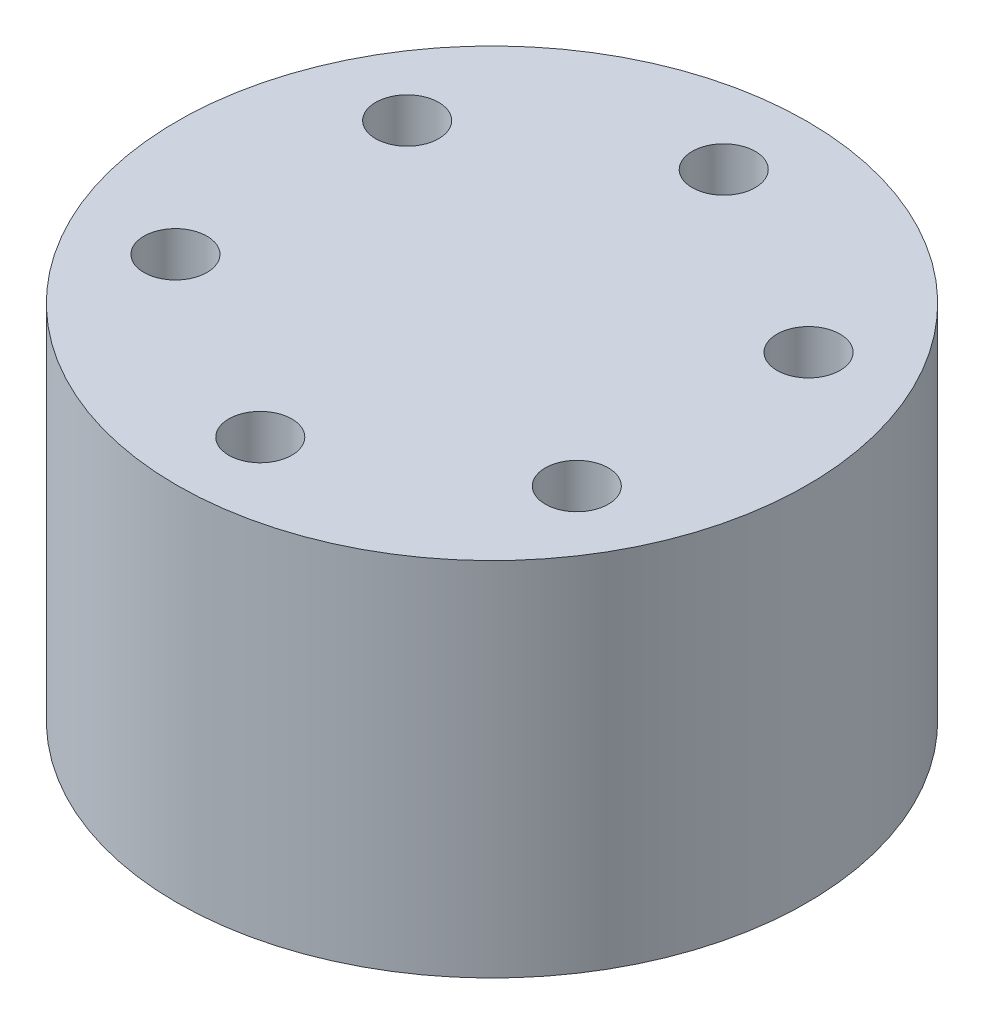
ISO-10303-21;
HEADER;
FILE_DESCRIPTION(('STEP AP214'),'2;1');
FILE_NAME('part.step','',(''),(''),'','','');
FILE_SCHEMA(('AUTOMOTIVE_DESIGN { 1 0 10303 214 1 1 1 1 }'));
ENDSEC;
DATA;
#1=APPLICATION_CONTEXT('core data for automotive mechanical design processes');
#2=APPLICATION_PROTOCOL_DEFINITION('international standard','automotive_design',2000,#1);
#3=PRODUCT_CONTEXT('',#1,'mechanical');
#4=PRODUCT('Part','Part','',(#3));
#5=PRODUCT_RELATED_PRODUCT_CATEGORY('part','',(#4));
#6=PRODUCT_DEFINITION_FORMATION('','',#4);
#7=PRODUCT_DEFINITION_CONTEXT('part definition',#1,'design');
#8=PRODUCT_DEFINITION('design','',#6,#7);
#9=PRODUCT_DEFINITION_SHAPE('','',#8);
#10=(LENGTH_UNIT() NAMED_UNIT(*) SI_UNIT(.MILLI.,.METRE.));
#11=(NAMED_UNIT(*) PLANE_ANGLE_UNIT() SI_UNIT($,.RADIAN.));
#12=(NAMED_UNIT(*) SI_UNIT($,.STERADIAN.) SOLID_ANGLE_UNIT());
#13=UNCERTAINTY_MEASURE_WITH_UNIT(LENGTH_MEASURE(1.E-05),#10,'distance_accuracy_value','');
#14=(GEOMETRIC_REPRESENTATION_CONTEXT(3) GLOBAL_UNCERTAINTY_ASSIGNED_CONTEXT((#13)) GLOBAL_UNIT_ASSIGNED_CONTEXT((#10,
#11,#12)) REPRESENTATION_CONTEXT('',''));
#15=CARTESIAN_POINT('',(0.,0.,0.));
#16=DIRECTION('',(0.,0.,1.));
#17=DIRECTION('',(1.,0.,0.));
#18=AXIS2_PLACEMENT_3D('',#15,#16,#17);
#19=CARTESIAN_POINT('',(0.,59.75,330.));
#20=DIRECTION('',(0.,-1.,0.));
#21=DIRECTION('',(0.,0.,-1.));
#22=AXIS2_PLACEMENT_3D('',#19,#20,#21);
#23=CYLINDRICAL_SURFACE('',#22,17.);
#24=CARTESIAN_POINT('',(0.,59.75,330.));
#25=DIRECTION('',(0.,1.,0.));
#26=DIRECTION('',(0.,0.,1.));
#27=AXIS2_PLACEMENT_3D('',#24,#25,#26);
#28=CIRCLE('',#27,17.);
#29=CARTESIAN_POINT('',(0.,59.75,347.));
#30=VERTEX_POINT('',#29);
#31=EDGE_CURVE('E10',#30,#30,#28,.T.);
#32=ORIENTED_EDGE('',*,*,#31,.F.);
#33=EDGE_LOOP('',(#32));
#34=FACE_BOUND('',#33,.T.);
#35=CARTESIAN_POINT('',(0.,40.25,330.));
#36=DIRECTION('',(0.,1.,0.));
#37=DIRECTION('',(0.,0.,1.));
#38=AXIS2_PLACEMENT_3D('',#35,#36,#37);
#39=CIRCLE('',#38,17.);
#40=CARTESIAN_POINT('',(0.,40.25,347.));
#41=VERTEX_POINT('',#40);
#42=EDGE_CURVE('E42',#41,#41,#39,.T.);
#43=ORIENTED_EDGE('',*,*,#42,.T.);
#44=EDGE_LOOP('',(#43));
#45=FACE_BOUND('',#44,.T.);
#46=ADVANCED_FACE('F41',(#34,#45),#23,.T.);
#47=CARTESIAN_POINT('',(0.,59.75,330.));
#48=DIRECTION('',(0.,1.,0.));
#49=DIRECTION('',(0.,0.,1.));
#50=AXIS2_PLACEMENT_3D('',#47,#48,#49);
#51=PLANE('',#50);
#52=CARTESIAN_POINT('',(10.8253175473055,59.75,323.75));
#53=DIRECTION('',(0.,1.,0.));
#54=DIRECTION('',(0.,0.,1.));
#55=AXIS2_PLACEMENT_3D('',#52,#53,#54);
#56=CIRCLE('',#55,1.7);
#57=CARTESIAN_POINT('',(10.8253175473055,59.75,325.45));
#58=VERTEX_POINT('',#57);
#59=EDGE_CURVE('E61',#58,#58,#56,.T.);
#60=ORIENTED_EDGE('',*,*,#59,.F.);
#61=EDGE_LOOP('',(#60));
#62=FACE_BOUND('',#61,.T.);
#63=CARTESIAN_POINT('',(0.,59.75,317.5));
#64=DIRECTION('',(0.,1.,0.));
#65=DIRECTION('',(0.,0.,1.));
#66=AXIS2_PLACEMENT_3D('',#63,#64,#65);
#67=CIRCLE('',#66,1.7);
#68=CARTESIAN_POINT('',(0.,59.75,319.2));
#69=VERTEX_POINT('',#68);
#70=EDGE_CURVE('E74',#69,#69,#67,.T.);
#71=ORIENTED_EDGE('',*,*,#70,.F.);
#72=EDGE_LOOP('',(#71));
#73=FACE_BOUND('',#72,.T.);
#74=CARTESIAN_POINT('',(-10.8253175473055,59.75,323.75));
#75=DIRECTION('',(0.,1.,0.));
#76=DIRECTION('',(0.,0.,1.));
#77=AXIS2_PLACEMENT_3D('',#74,#75,#76);
#78=CIRCLE('',#77,1.7);
#79=CARTESIAN_POINT('',(-10.8253175473055,59.75,325.45));
#80=VERTEX_POINT('',#79);
#81=EDGE_CURVE('E81',#80,#80,#78,.T.);
#82=ORIENTED_EDGE('',*,*,#81,.F.);
#83=EDGE_LOOP('',(#82));
#84=FACE_BOUND('',#83,.T.);
#85=CARTESIAN_POINT('',(-10.8253175473055,59.75,336.25));
#86=DIRECTION('',(0.,1.,0.));
#87=DIRECTION('',(0.,0.,1.));
#88=AXIS2_PLACEMENT_3D('',#85,#86,#87);
#89=CIRCLE('',#88,1.7);
#90=CARTESIAN_POINT('',(-10.8253175473055,59.75,337.95));
#91=VERTEX_POINT('',#90);
#92=EDGE_CURVE('E90',#91,#91,#89,.T.);
#93=ORIENTED_EDGE('',*,*,#92,.F.);
#94=EDGE_LOOP('',(#93));
#95=FACE_BOUND('',#94,.T.);
#96=CARTESIAN_POINT('',(0.,59.75,342.5));
#97=DIRECTION('',(0.,1.,0.));
#98=DIRECTION('',(0.,0.,1.));
#99=AXIS2_PLACEMENT_3D('',#96,#97,#98);
#100=CIRCLE('',#99,1.7);
#101=CARTESIAN_POINT('',(0.,59.75,344.2));
#102=VERTEX_POINT('',#101);
#103=EDGE_CURVE('E100',#102,#102,#100,.T.);
#104=ORIENTED_EDGE('',*,*,#103,.F.);
#105=EDGE_LOOP('',(#104));
#106=FACE_BOUND('',#105,.T.);
#107=CARTESIAN_POINT('',(10.8253175473055,59.75,336.25));
#108=DIRECTION('',(0.,1.,0.));
#109=DIRECTION('',(0.,0.,1.));
#110=AXIS2_PLACEMENT_3D('',#107,#108,#109);
#111=CIRCLE('',#110,1.7);
#112=CARTESIAN_POINT('',(10.8253175473055,59.75,337.95));
#113=VERTEX_POINT('',#112);
#114=EDGE_CURVE('E54',#113,#113,#111,.T.);
#115=ORIENTED_EDGE('',*,*,#114,.F.);
#116=EDGE_LOOP('',(#115));
#117=FACE_BOUND('',#116,.T.);
#118=ORIENTED_EDGE('',*,*,#31,.T.);
#119=EDGE_LOOP('',(#118));
#120=FACE_BOUND('',#119,.T.);
#121=ADVANCED_FACE('F137',(#62,#73,#84,#95,#106,#117,#120),#51,.T.);
#122=CARTESIAN_POINT('',(0.,40.25,330.));
#123=DIRECTION('',(0.,1.,0.));
#124=DIRECTION('',(0.,0.,1.));
#125=AXIS2_PLACEMENT_3D('',#122,#123,#124);
#126=PLANE('',#125);
#127=CARTESIAN_POINT('',(10.2,40.25,330.));
#128=DIRECTION('',(0.,1.,0.));
#129=DIRECTION('',(0.,0.,1.));
#130=AXIS2_PLACEMENT_3D('',#127,#128,#129);
#131=CIRCLE('',#130,2.1);
#132=CARTESIAN_POINT('',(10.2,40.25,332.1));
#133=VERTEX_POINT('',#132);
#134=EDGE_CURVE('E120',#133,#133,#131,.T.);
#135=ORIENTED_EDGE('',*,*,#134,.T.);
#136=EDGE_LOOP('',(#135));
#137=FACE_BOUND('',#136,.T.);
#138=CARTESIAN_POINT('',(-5.1,40.25,338.833459118601));
#139=DIRECTION('',(0.,1.,0.));
#140=DIRECTION('',(0.,0.,1.));
#141=AXIS2_PLACEMENT_3D('',#138,#139,#140);
#142=CIRCLE('',#141,2.1);
#143=CARTESIAN_POINT('',(-5.1,40.25,340.933459118601));
#144=VERTEX_POINT('',#143);
#145=EDGE_CURVE('E118',#144,#144,#142,.T.);
#146=ORIENTED_EDGE('',*,*,#145,.T.);
#147=EDGE_LOOP('',(#146));
#148=FACE_BOUND('',#147,.T.);
#149=CARTESIAN_POINT('',(-5.1,40.25,321.166540881399));
#150=DIRECTION('',(0.,1.,0.));
#151=DIRECTION('',(0.,0.,1.));
#152=AXIS2_PLACEMENT_3D('',#149,#150,#151);
#153=CIRCLE('',#152,2.1);
#154=CARTESIAN_POINT('',(-5.1,40.25,323.266540881399));
#155=VERTEX_POINT('',#154);
#156=EDGE_CURVE('E107',#155,#155,#153,.T.);
#157=ORIENTED_EDGE('',*,*,#156,.T.);
#158=EDGE_LOOP('',(#157));
#159=FACE_BOUND('',#158,.T.);
#160=CARTESIAN_POINT('',(10.8253175473055,40.25,323.75));
#161=DIRECTION('',(0.,1.,0.));
#162=DIRECTION('',(0.,0.,1.));
#163=AXIS2_PLACEMENT_3D('',#160,#161,#162);
#164=CIRCLE('',#163,1.7);
#165=CARTESIAN_POINT('',(10.8253175473055,40.25,325.45));
#166=VERTEX_POINT('',#165);
#167=EDGE_CURVE('E68',#166,#166,#164,.T.);
#168=ORIENTED_EDGE('',*,*,#167,.T.);
#169=EDGE_LOOP('',(#168));
#170=FACE_BOUND('',#169,.T.);
#171=CARTESIAN_POINT('',(0.,40.25,317.5));
#172=DIRECTION('',(0.,1.,0.));
#173=DIRECTION('',(0.,0.,1.));
#174=AXIS2_PLACEMENT_3D('',#171,#172,#173);
#175=CIRCLE('',#174,1.7);
#176=CARTESIAN_POINT('',(0.,40.25,319.2));
#177=VERTEX_POINT('',#176);
#178=EDGE_CURVE('E77',#177,#177,#175,.T.);
#179=ORIENTED_EDGE('',*,*,#178,.T.);
#180=EDGE_LOOP('',(#179));
#181=FACE_BOUND('',#180,.T.);
#182=CARTESIAN_POINT('',(-10.8253175473055,40.25,323.75));
#183=DIRECTION('',(0.,1.,0.));
#184=DIRECTION('',(0.,0.,1.));
#185=AXIS2_PLACEMENT_3D('',#182,#183,#184);
#186=CIRCLE('',#185,1.7);
#187=CARTESIAN_POINT('',(-10.8253175473055,40.25,325.45));
#188=VERTEX_POINT('',#187);
#189=EDGE_CURVE('E84',#188,#188,#186,.T.);
#190=ORIENTED_EDGE('',*,*,#189,.T.);
#191=EDGE_LOOP('',(#190));
#192=FACE_BOUND('',#191,.T.);
#193=CARTESIAN_POINT('',(-10.8253175473055,40.25,336.25));
#194=DIRECTION('',(0.,1.,0.));
#195=DIRECTION('',(0.,0.,1.));
#196=AXIS2_PLACEMENT_3D('',#193,#194,#195);
#197=CIRCLE('',#196,1.7);
#198=CARTESIAN_POINT('',(-10.8253175473055,40.25,337.95));
#199=VERTEX_POINT('',#198);
#200=EDGE_CURVE('E91',#199,#199,#197,.T.);
#201=ORIENTED_EDGE('',*,*,#200,.T.);
#202=EDGE_LOOP('',(#201));
#203=FACE_BOUND('',#202,.T.);
#204=CARTESIAN_POINT('',(0.,40.25,342.5));
#205=DIRECTION('',(0.,1.,0.));
#206=DIRECTION('',(0.,0.,1.));
#207=AXIS2_PLACEMENT_3D('',#204,#205,#206);
#208=CIRCLE('',#207,1.7);
#209=CARTESIAN_POINT('',(0.,40.25,344.2));
#210=VERTEX_POINT('',#209);
#211=EDGE_CURVE('E63',#210,#210,#208,.T.);
#212=ORIENTED_EDGE('',*,*,#211,.T.);
#213=EDGE_LOOP('',(#212));
#214=FACE_BOUND('',#213,.T.);
#215=CARTESIAN_POINT('',(10.8253175473055,40.25,336.25));
#216=DIRECTION('',(0.,1.,0.));
#217=DIRECTION('',(0.,0.,1.));
#218=AXIS2_PLACEMENT_3D('',#215,#216,#217);
#219=CIRCLE('',#218,1.7);
#220=CARTESIAN_POINT('',(10.8253175473055,40.25,337.95));
#221=VERTEX_POINT('',#220);
#222=EDGE_CURVE('E60',#221,#221,#219,.T.);
#223=ORIENTED_EDGE('',*,*,#222,.T.);
#224=EDGE_LOOP('',(#223));
#225=FACE_BOUND('',#224,.T.);
#226=ORIENTED_EDGE('',*,*,#42,.F.);
#227=EDGE_LOOP('',(#226));
#228=FACE_BOUND('',#227,.T.);
#229=ADVANCED_FACE('F142',(#137,#148,#159,#170,#181,#192,#203,#214,#225,#228),#126,.F.);
#230=CARTESIAN_POINT('',(10.8253175473055,59.75,336.25));
#231=DIRECTION('',(0.,-1.,0.));
#232=DIRECTION('',(0.,0.,-1.));
#233=AXIS2_PLACEMENT_3D('',#230,#231,#232);
#234=CYLINDRICAL_SURFACE('',#233,1.7);
#235=ORIENTED_EDGE('',*,*,#114,.T.);
#236=EDGE_LOOP('',(#235));
#237=FACE_BOUND('',#236,.T.);
#238=ORIENTED_EDGE('',*,*,#222,.F.);
#239=EDGE_LOOP('',(#238));
#240=FACE_BOUND('',#239,.T.);
#241=ADVANCED_FACE('F149',(#237,#240),#234,.F.);
#242=CARTESIAN_POINT('',(0.,59.75,342.5));
#243=DIRECTION('',(0.,-1.,0.));
#244=DIRECTION('',(0.,0.,-1.));
#245=AXIS2_PLACEMENT_3D('',#242,#243,#244);
#246=CYLINDRICAL_SURFACE('',#245,1.7);
#247=ORIENTED_EDGE('',*,*,#103,.T.);
#248=EDGE_LOOP('',(#247));
#249=FACE_BOUND('',#248,.T.);
#250=ORIENTED_EDGE('',*,*,#211,.F.);
#251=EDGE_LOOP('',(#250));
#252=FACE_BOUND('',#251,.T.);
#253=ADVANCED_FACE('F153',(#249,#252),#246,.F.);
#254=CARTESIAN_POINT('',(-10.8253175473055,59.75,336.25));
#255=DIRECTION('',(0.,-1.,0.));
#256=DIRECTION('',(0.,0.,-1.));
#257=AXIS2_PLACEMENT_3D('',#254,#255,#256);
#258=CYLINDRICAL_SURFACE('',#257,1.7);
#259=ORIENTED_EDGE('',*,*,#92,.T.);
#260=EDGE_LOOP('',(#259));
#261=FACE_BOUND('',#260,.T.);
#262=ORIENTED_EDGE('',*,*,#200,.F.);
#263=EDGE_LOOP('',(#262));
#264=FACE_BOUND('',#263,.T.);
#265=ADVANCED_FACE('F168',(#261,#264),#258,.F.);
#266=CARTESIAN_POINT('',(-10.8253175473055,59.75,323.75));
#267=DIRECTION('',(0.,-1.,0.));
#268=DIRECTION('',(0.,0.,-1.));
#269=AXIS2_PLACEMENT_3D('',#266,#267,#268);
#270=CYLINDRICAL_SURFACE('',#269,1.7);
#271=ORIENTED_EDGE('',*,*,#81,.T.);
#272=EDGE_LOOP('',(#271));
#273=FACE_BOUND('',#272,.T.);
#274=ORIENTED_EDGE('',*,*,#189,.F.);
#275=EDGE_LOOP('',(#274));
#276=FACE_BOUND('',#275,.T.);
#277=ADVANCED_FACE('F167',(#273,#276),#270,.F.);
#278=CARTESIAN_POINT('',(0.,59.75,317.5));
#279=DIRECTION('',(0.,-1.,0.));
#280=DIRECTION('',(0.,0.,-1.));
#281=AXIS2_PLACEMENT_3D('',#278,#279,#280);
#282=CYLINDRICAL_SURFACE('',#281,1.7);
#283=ORIENTED_EDGE('',*,*,#70,.T.);
#284=EDGE_LOOP('',(#283));
#285=FACE_BOUND('',#284,.T.);
#286=ORIENTED_EDGE('',*,*,#178,.F.);
#287=EDGE_LOOP('',(#286));
#288=FACE_BOUND('',#287,.T.);
#289=ADVANCED_FACE('F165',(#285,#288),#282,.F.);
#290=CARTESIAN_POINT('',(10.8253175473055,59.75,323.75));
#291=DIRECTION('',(0.,-1.,0.));
#292=DIRECTION('',(0.,0.,-1.));
#293=AXIS2_PLACEMENT_3D('',#290,#291,#292);
#294=CYLINDRICAL_SURFACE('',#293,1.7);
#295=ORIENTED_EDGE('',*,*,#59,.T.);
#296=EDGE_LOOP('',(#295));
#297=FACE_BOUND('',#296,.T.);
#298=ORIENTED_EDGE('',*,*,#167,.F.);
#299=EDGE_LOOP('',(#298));
#300=FACE_BOUND('',#299,.T.);
#301=ADVANCED_FACE('F158',(#297,#300),#294,.F.);
#302=CARTESIAN_POINT('',(-5.1,43.75,321.166540881399));
#303=DIRECTION('',(0.,-1.,0.));
#304=DIRECTION('',(0.,0.,-1.));
#305=AXIS2_PLACEMENT_3D('',#302,#303,#304);
#306=CYLINDRICAL_SURFACE('',#305,2.1);
#307=CARTESIAN_POINT('',(-5.1,43.75,321.166540881399));
#308=DIRECTION('',(0.,1.,0.));
#309=DIRECTION('',(0.,0.,1.));
#310=AXIS2_PLACEMENT_3D('',#307,#308,#309);
#311=CIRCLE('',#310,2.1);
#312=CARTESIAN_POINT('',(-5.1,43.75,323.266540881399));
#313=VERTEX_POINT('',#312);
#314=EDGE_CURVE('E102',#313,#313,#311,.T.);
#315=ORIENTED_EDGE('',*,*,#314,.T.);
#316=EDGE_LOOP('',(#315));
#317=FACE_BOUND('',#316,.T.);
#318=ORIENTED_EDGE('',*,*,#156,.F.);
#319=EDGE_LOOP('',(#318));
#320=FACE_BOUND('',#319,.T.);
#321=ADVANCED_FACE('F161',(#317,#320),#306,.F.);
#322=CARTESIAN_POINT('',(-5.1,43.75,321.166540881399));
#323=DIRECTION('',(0.,1.,0.));
#324=DIRECTION('',(0.,0.,1.));
#325=AXIS2_PLACEMENT_3D('',#322,#323,#324);
#326=PLANE('',#325);
#327=ORIENTED_EDGE('',*,*,#314,.F.);
#328=EDGE_LOOP('',(#327));
#329=FACE_BOUND('',#328,.T.);
#330=ADVANCED_FACE('F177',(#329),#326,.F.);
#331=CARTESIAN_POINT('',(-5.1,43.75,338.833459118601));
#332=DIRECTION('',(0.,-1.,0.));
#333=DIRECTION('',(0.,0.,-1.));
#334=AXIS2_PLACEMENT_3D('',#331,#332,#333);
#335=CYLINDRICAL_SURFACE('',#334,2.1);
#336=CARTESIAN_POINT('',(-5.1,43.75,338.833459118601));
#337=DIRECTION('',(0.,1.,0.));
#338=DIRECTION('',(0.,0.,1.));
#339=AXIS2_PLACEMENT_3D('',#336,#337,#338);
#340=CIRCLE('',#339,2.1);
#341=CARTESIAN_POINT('',(-5.1,43.75,340.933459118601));
#342=VERTEX_POINT('',#341);
#343=EDGE_CURVE('E115',#342,#342,#340,.T.);
#344=ORIENTED_EDGE('',*,*,#343,.T.);
#345=EDGE_LOOP('',(#344));
#346=FACE_BOUND('',#345,.T.);
#347=ORIENTED_EDGE('',*,*,#145,.F.);
#348=EDGE_LOOP('',(#347));
#349=FACE_BOUND('',#348,.T.);
#350=ADVANCED_FACE('F182',(#346,#349),#335,.F.);
#351=CARTESIAN_POINT('',(-5.1,43.75,338.833459118601));
#352=DIRECTION('',(0.,1.,0.));
#353=DIRECTION('',(0.,0.,1.));
#354=AXIS2_PLACEMENT_3D('',#351,#352,#353);
#355=PLANE('',#354);
#356=ORIENTED_EDGE('',*,*,#343,.F.);
#357=EDGE_LOOP('',(#356));
#358=FACE_BOUND('',#357,.T.);
#359=ADVANCED_FACE('F131',(#358),#355,.F.);
#360=CARTESIAN_POINT('',(10.2,43.75,330.));
#361=DIRECTION('',(0.,-1.,0.));
#362=DIRECTION('',(0.,0.,-1.));
#363=AXIS2_PLACEMENT_3D('',#360,#361,#362);
#364=CYLINDRICAL_SURFACE('',#363,2.1);
#365=CARTESIAN_POINT('',(10.2,43.75,330.));
#366=DIRECTION('',(0.,1.,0.));
#367=DIRECTION('',(0.,0.,1.));
#368=AXIS2_PLACEMENT_3D('',#365,#366,#367);
#369=CIRCLE('',#368,2.1);
#370=CARTESIAN_POINT('',(10.2,43.75,332.1));
#371=VERTEX_POINT('',#370);
#372=EDGE_CURVE('E69',#371,#371,#369,.T.);
#373=ORIENTED_EDGE('',*,*,#372,.T.);
#374=EDGE_LOOP('',(#373));
#375=FACE_BOUND('',#374,.T.);
#376=ORIENTED_EDGE('',*,*,#134,.F.);
#377=EDGE_LOOP('',(#376));
#378=FACE_BOUND('',#377,.T.);
#379=ADVANCED_FACE('F130',(#375,#378),#364,.F.);
#380=CARTESIAN_POINT('',(10.2,43.75,330.));
#381=DIRECTION('',(0.,1.,0.));
#382=DIRECTION('',(0.,0.,1.));
#383=AXIS2_PLACEMENT_3D('',#380,#381,#382);
#384=PLANE('',#383);
#385=ORIENTED_EDGE('',*,*,#372,.F.);
#386=EDGE_LOOP('',(#385));
#387=FACE_BOUND('',#386,.T.);
#388=ADVANCED_FACE('F128',(#387),#384,.F.);
#389=CLOSED_SHELL('',(#46,#121,#229,#241,#253,#265,#277,#289,#301,#321,#330,#350,#359,#379,#388));
#390=MANIFOLD_SOLID_BREP('B2',#389);
#391=ADVANCED_BREP_SHAPE_REPRESENTATION('',(#18,#390),#14);
#392=SHAPE_DEFINITION_REPRESENTATION(#9,#391);
ENDSEC;
END-ISO-10303-21;
